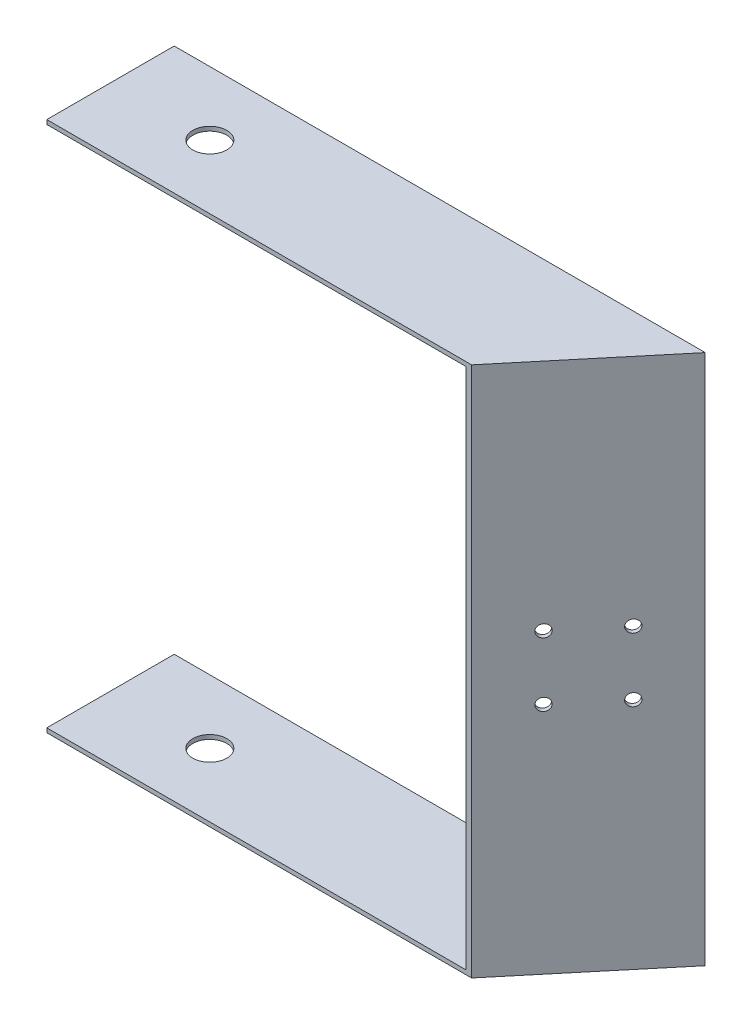
ISO-10303-21;
HEADER;
FILE_DESCRIPTION(('STEP AP214'),'2;1');
FILE_NAME('part.step','',(''),(''),'','','');
FILE_SCHEMA(('AUTOMOTIVE_DESIGN { 1 0 10303 214 1 1 1 1 }'));
ENDSEC;
DATA;
#1=APPLICATION_CONTEXT('core data for automotive mechanical design processes');
#2=APPLICATION_PROTOCOL_DEFINITION('international standard','automotive_design',2000,#1);
#3=PRODUCT_CONTEXT('',#1,'mechanical');
#4=PRODUCT('Part','Part','',(#3));
#5=PRODUCT_RELATED_PRODUCT_CATEGORY('part','',(#4));
#6=PRODUCT_DEFINITION_FORMATION('','',#4);
#7=PRODUCT_DEFINITION_CONTEXT('part definition',#1,'design');
#8=PRODUCT_DEFINITION('design','',#6,#7);
#9=PRODUCT_DEFINITION_SHAPE('','',#8);
#10=(LENGTH_UNIT() NAMED_UNIT(*) SI_UNIT(.MILLI.,.METRE.));
#11=(NAMED_UNIT(*) PLANE_ANGLE_UNIT() SI_UNIT($,.RADIAN.));
#12=(NAMED_UNIT(*) SI_UNIT($,.STERADIAN.) SOLID_ANGLE_UNIT());
#13=UNCERTAINTY_MEASURE_WITH_UNIT(LENGTH_MEASURE(1.E-05),#10,'distance_accuracy_value','');
#14=(GEOMETRIC_REPRESENTATION_CONTEXT(3) GLOBAL_UNCERTAINTY_ASSIGNED_CONTEXT((#13)) GLOBAL_UNIT_ASSIGNED_CONTEXT((#10,
#11,#12)) REPRESENTATION_CONTEXT('',''));
#15=CARTESIAN_POINT('',(0.,0.,0.));
#16=DIRECTION('',(0.,0.,1.));
#17=DIRECTION('',(1.,0.,0.));
#18=AXIS2_PLACEMENT_3D('',#15,#16,#17);
#19=CARTESIAN_POINT('',(0.,0.,30.));
#20=DIRECTION('',(1.,0.,0.));
#21=DIRECTION('',(0.,0.,-1.));
#22=AXIS2_PLACEMENT_3D('',#19,#20,#21);
#23=PLANE('',#22);
#24=DIRECTION('',(0.,0.,-1.));
#25=VECTOR('',#24,1.);
#26=CARTESIAN_POINT('',(0.,124.,30.));
#27=LINE('',#26,#25);
#28=CARTESIAN_POINT('',(0.,124.,30.));
#29=VERTEX_POINT('',#28);
#30=CARTESIAN_POINT('',(0.,124.,0.));
#31=VERTEX_POINT('',#30);
#32=EDGE_CURVE('E156',#29,#31,#27,.T.);
#33=ORIENTED_EDGE('',*,*,#32,.F.);
#34=DIRECTION('',(0.,-1.,0.));
#35=VECTOR('',#34,1.);
#36=CARTESIAN_POINT('',(0.,0.,30.));
#37=LINE('',#36,#35);
#38=CARTESIAN_POINT('',(0.,125.,30.));
#39=VERTEX_POINT('',#38);
#40=EDGE_CURVE('E98',#39,#29,#37,.T.);
#41=ORIENTED_EDGE('',*,*,#40,.F.);
#42=DIRECTION('',(0.,0.,-1.));
#43=VECTOR('',#42,1.);
#44=CARTESIAN_POINT('',(0.,125.,30.));
#45=LINE('',#44,#43);
#46=CARTESIAN_POINT('',(0.,125.,0.));
#47=VERTEX_POINT('',#46);
#48=EDGE_CURVE('E46',#39,#47,#45,.T.);
#49=ORIENTED_EDGE('',*,*,#48,.T.);
#50=DIRECTION('',(0.,-1.,0.));
#51=VECTOR('',#50,1.);
#52=CARTESIAN_POINT('',(0.,0.,0.));
#53=LINE('',#52,#51);
#54=EDGE_CURVE('E97',#47,#31,#53,.T.);
#55=ORIENTED_EDGE('',*,*,#54,.T.);
#56=EDGE_LOOP('',(#33,#41,#49,#55));
#57=FACE_BOUND('',#56,.T.);
#58=ADVANCED_FACE('F37',(#57),#23,.F.);
#59=CARTESIAN_POINT('',(0.,0.,30.));
#60=DIRECTION('',(0.,0.,-1.));
#61=DIRECTION('',(-1.,0.,0.));
#62=AXIS2_PLACEMENT_3D('',#59,#60,#61);
#63=PLANE('',#62);
#64=DIRECTION('',(1.,0.,0.));
#65=VECTOR('',#64,1.);
#66=CARTESIAN_POINT('',(0.,1.,30.));
#67=LINE('',#66,#65);
#68=CARTESIAN_POINT('',(0.,1.,30.));
#69=VERTEX_POINT('',#68);
#70=CARTESIAN_POINT('',(98.6982917206822,1.,30.));
#71=VERTEX_POINT('',#70);
#72=EDGE_CURVE('E157',#69,#71,#67,.T.);
#73=ORIENTED_EDGE('',*,*,#72,.F.);
#74=CARTESIAN_POINT('',(0.,0.,30.));
#75=VERTEX_POINT('',#74);
#76=EDGE_CURVE('E90',#69,#75,#37,.T.);
#77=ORIENTED_EDGE('',*,*,#76,.T.);
#78=DIRECTION('',(1.,0.,0.));
#79=VECTOR('',#78,1.);
#80=CARTESIAN_POINT('',(0.,0.,30.));
#81=LINE('',#80,#79);
#82=CARTESIAN_POINT('',(100.,0.,30.));
#83=VERTEX_POINT('',#82);
#84=EDGE_CURVE('E174',#75,#83,#81,.T.);
#85=ORIENTED_EDGE('',*,*,#84,.T.);
#86=DIRECTION('',(0.,1.,0.));
#87=VECTOR('',#86,1.);
#88=CARTESIAN_POINT('',(100.,0.,30.));
#89=LINE('',#88,#87);
#90=CARTESIAN_POINT('',(100.,125.,30.));
#91=VERTEX_POINT('',#90);
#92=EDGE_CURVE('E109',#83,#91,#89,.T.);
#93=ORIENTED_EDGE('',*,*,#92,.T.);
#94=DIRECTION('',(-1.,0.,0.));
#95=VECTOR('',#94,1.);
#96=CARTESIAN_POINT('',(0.,125.,30.));
#97=LINE('',#96,#95);
#98=EDGE_CURVE('E63',#91,#39,#97,.T.);
#99=ORIENTED_EDGE('',*,*,#98,.T.);
#100=ORIENTED_EDGE('',*,*,#40,.T.);
#101=DIRECTION('',(-1.,0.,0.));
#102=VECTOR('',#101,1.);
#103=CARTESIAN_POINT('',(0.,124.,30.));
#104=LINE('',#103,#102);
#105=CARTESIAN_POINT('',(98.6982917206822,124.,30.));
#106=VERTEX_POINT('',#105);
#107=EDGE_CURVE('E160',#106,#29,#104,.T.);
#108=ORIENTED_EDGE('',*,*,#107,.F.);
#109=DIRECTION('',(0.,1.,0.));
#110=VECTOR('',#109,1.);
#111=CARTESIAN_POINT('',(98.6982917206822,0.,30.));
#112=LINE('',#111,#110);
#113=EDGE_CURVE('E147',#71,#106,#112,.T.);
#114=ORIENTED_EDGE('',*,*,#113,.F.);
#115=EDGE_LOOP('',(#73,#77,#85,#93,#99,#100,#108,#114));
#116=FACE_BOUND('',#115,.T.);
#117=ADVANCED_FACE('F178',(#116),#63,.F.);
#118=CARTESIAN_POINT('',(0.,0.,0.));
#119=DIRECTION('',(0.,0.,-1.));
#120=DIRECTION('',(-1.,0.,0.));
#121=AXIS2_PLACEMENT_3D('',#118,#119,#120);
#122=PLANE('',#121);
#123=DIRECTION('',(0.,1.,0.));
#124=VECTOR('',#123,1.);
#125=CARTESIAN_POINT('',(123.698291720682,0.,0.));
#126=LINE('',#125,#124);
#127=CARTESIAN_POINT('',(123.698291720682,1.,0.));
#128=VERTEX_POINT('',#127);
#129=CARTESIAN_POINT('',(123.698291720682,124.,0.));
#130=VERTEX_POINT('',#129);
#131=EDGE_CURVE('E54',#128,#130,#126,.T.);
#132=ORIENTED_EDGE('',*,*,#131,.T.);
#133=DIRECTION('',(-1.,0.,0.));
#134=VECTOR('',#133,1.);
#135=CARTESIAN_POINT('',(0.,124.,0.));
#136=LINE('',#135,#134);
#137=EDGE_CURVE('E103',#130,#31,#136,.T.);
#138=ORIENTED_EDGE('',*,*,#137,.T.);
#139=ORIENTED_EDGE('',*,*,#54,.F.);
#140=DIRECTION('',(-1.,0.,0.));
#141=VECTOR('',#140,1.);
#142=CARTESIAN_POINT('',(0.,125.,0.));
#143=LINE('',#142,#141);
#144=CARTESIAN_POINT('',(125.,125.,0.));
#145=VERTEX_POINT('',#144);
#146=EDGE_CURVE('E80',#145,#47,#143,.T.);
#147=ORIENTED_EDGE('',*,*,#146,.F.);
#148=DIRECTION('',(0.,1.,0.));
#149=VECTOR('',#148,1.);
#150=CARTESIAN_POINT('',(125.,0.,0.));
#151=LINE('',#150,#149);
#152=CARTESIAN_POINT('',(125.,0.,0.));
#153=VERTEX_POINT('',#152);
#154=EDGE_CURVE('E91',#153,#145,#151,.T.);
#155=ORIENTED_EDGE('',*,*,#154,.F.);
#156=DIRECTION('',(1.,0.,0.));
#157=VECTOR('',#156,1.);
#158=CARTESIAN_POINT('',(0.,0.,0.));
#159=LINE('',#158,#157);
#160=CARTESIAN_POINT('',(0.,0.,0.));
#161=VERTEX_POINT('',#160);
#162=EDGE_CURVE('E104',#161,#153,#159,.T.);
#163=ORIENTED_EDGE('',*,*,#162,.F.);
#164=CARTESIAN_POINT('',(0.,1.,0.));
#165=VERTEX_POINT('',#164);
#166=EDGE_CURVE('E105',#165,#161,#53,.T.);
#167=ORIENTED_EDGE('',*,*,#166,.F.);
#168=DIRECTION('',(1.,0.,0.));
#169=VECTOR('',#168,1.);
#170=CARTESIAN_POINT('',(0.,1.,0.));
#171=LINE('',#170,#169);
#172=EDGE_CURVE('E150',#165,#128,#171,.T.);
#173=ORIENTED_EDGE('',*,*,#172,.T.);
#174=EDGE_LOOP('',(#132,#138,#139,#147,#155,#163,#167,#173));
#175=FACE_BOUND('',#174,.T.);
#176=ADVANCED_FACE('F101',(#175),#122,.T.);
#177=ORIENTED_EDGE('',*,*,#76,.F.);
#178=DIRECTION('',(0.,0.,-1.));
#179=VECTOR('',#178,1.);
#180=CARTESIAN_POINT('',(0.,1.,30.));
#181=LINE('',#180,#179);
#182=EDGE_CURVE('E153',#69,#165,#181,.T.);
#183=ORIENTED_EDGE('',*,*,#182,.T.);
#184=ORIENTED_EDGE('',*,*,#166,.T.);
#185=DIRECTION('',(0.,0.,-1.));
#186=VECTOR('',#185,1.);
#187=CARTESIAN_POINT('',(0.,0.,30.));
#188=LINE('',#187,#186);
#189=EDGE_CURVE('E11',#75,#161,#188,.T.);
#190=ORIENTED_EDGE('',*,*,#189,.F.);
#191=EDGE_LOOP('',(#177,#183,#184,#190));
#192=FACE_BOUND('',#191,.T.);
#193=ADVANCED_FACE('F39',(#192),#23,.F.);
#194=CARTESIAN_POINT('',(0.,0.,30.));
#195=DIRECTION('',(0.,1.,0.));
#196=DIRECTION('',(0.,0.,1.));
#197=AXIS2_PLACEMENT_3D('',#194,#195,#196);
#198=PLANE('',#197);
#199=CARTESIAN_POINT('',(23.3801743676135,0.,15.));
#200=DIRECTION('',(0.,-1.,0.));
#201=DIRECTION('',(0.,0.,-1.));
#202=AXIS2_PLACEMENT_3D('',#199,#200,#201);
#203=CIRCLE('',#202,4.);
#204=CARTESIAN_POINT('',(23.3801743676135,0.,11.));
#205=VERTEX_POINT('',#204);
#206=EDGE_CURVE('E131',#205,#205,#203,.T.);
#207=ORIENTED_EDGE('',*,*,#206,.F.);
#208=EDGE_LOOP('',(#207));
#209=FACE_BOUND('',#208,.T.);
#210=ORIENTED_EDGE('',*,*,#162,.T.);
#211=DIRECTION('',(-0.64018439966448,0.,0.768221279597376));
#212=VECTOR('',#211,1.);
#213=CARTESIAN_POINT('',(125.,0.,0.));
#214=LINE('',#213,#212);
#215=EDGE_CURVE('E169',#153,#83,#214,.T.);
#216=ORIENTED_EDGE('',*,*,#215,.T.);
#217=ORIENTED_EDGE('',*,*,#84,.F.);
#218=ORIENTED_EDGE('',*,*,#189,.T.);
#219=EDGE_LOOP('',(#210,#216,#217,#218));
#220=FACE_BOUND('',#219,.T.);
#221=ADVANCED_FACE('F185',(#209,#220),#198,.F.);
#222=CARTESIAN_POINT('',(0.,125.,30.));
#223=DIRECTION('',(0.,-1.,0.));
#224=DIRECTION('',(0.,0.,-1.));
#225=AXIS2_PLACEMENT_3D('',#222,#223,#224);
#226=PLANE('',#225);
#227=CARTESIAN_POINT('',(23.3801743676135,125.,15.));
#228=DIRECTION('',(0.,-1.,0.));
#229=DIRECTION('',(0.,0.,-1.));
#230=AXIS2_PLACEMENT_3D('',#227,#228,#229);
#231=CIRCLE('',#230,4.);
#232=CARTESIAN_POINT('',(23.3801743676135,125.,11.));
#233=VERTEX_POINT('',#232);
#234=EDGE_CURVE('E119',#233,#233,#231,.T.);
#235=ORIENTED_EDGE('',*,*,#234,.T.);
#236=EDGE_LOOP('',(#235));
#237=FACE_BOUND('',#236,.T.);
#238=ORIENTED_EDGE('',*,*,#98,.F.);
#239=DIRECTION('',(-0.64018439966448,0.,0.768221279597376));
#240=VECTOR('',#239,1.);
#241=CARTESIAN_POINT('',(125.,125.,0.));
#242=LINE('',#241,#240);
#243=EDGE_CURVE('E86',#145,#91,#242,.T.);
#244=ORIENTED_EDGE('',*,*,#243,.F.);
#245=ORIENTED_EDGE('',*,*,#146,.T.);
#246=ORIENTED_EDGE('',*,*,#48,.F.);
#247=EDGE_LOOP('',(#238,#244,#245,#246));
#248=FACE_BOUND('',#247,.T.);
#249=ADVANCED_FACE('F82',(#237,#248),#226,.F.);
#250=CARTESIAN_POINT('',(125.,0.,0.));
#251=DIRECTION('',(-0.768221279597376,0.,-0.64018439966448));
#252=DIRECTION('',(-0.64018439966448,0.,0.768221279597376));
#253=AXIS2_PLACEMENT_3D('',#250,#251,#252);
#254=PLANE('',#253);
#255=CARTESIAN_POINT('',(117.301382997484,70.,9.23834040301972));
#256=DIRECTION('',(0.768221279597376,0.,0.64018439966448));
#257=DIRECTION('',(0.64018439966448,0.,-0.768221279597376));
#258=AXIS2_PLACEMENT_3D('',#255,#256,#257);
#259=CIRCLE('',#258,1.45);
#260=CARTESIAN_POINT('',(118.229650376997,70.,8.12441954760353));
#261=VERTEX_POINT('',#260);
#262=EDGE_CURVE('E284',#261,#261,#259,.T.);
#263=ORIENTED_EDGE('',*,*,#262,.F.);
#264=EDGE_LOOP('',(#263));
#265=FACE_BOUND('',#264,.T.);
#266=CARTESIAN_POINT('',(107.698617002516,55.,20.7616595969804));
#267=DIRECTION('',(0.768221279597376,0.,0.64018439966448));
#268=DIRECTION('',(0.64018439966448,0.,-0.768221279597376));
#269=AXIS2_PLACEMENT_3D('',#266,#267,#268);
#270=CIRCLE('',#269,1.44999999999999);
#271=CARTESIAN_POINT('',(108.62688438203,55.,19.6477387415642));
#272=VERTEX_POINT('',#271);
#273=EDGE_CURVE('E281',#272,#272,#270,.T.);
#274=ORIENTED_EDGE('',*,*,#273,.F.);
#275=EDGE_LOOP('',(#274));
#276=FACE_BOUND('',#275,.T.);
#277=CARTESIAN_POINT('',(117.301382997484,55.,9.23834040301972));
#278=DIRECTION('',(0.768221279597376,0.,0.64018439966448));
#279=DIRECTION('',(0.64018439966448,0.,-0.768221279597376));
#280=AXIS2_PLACEMENT_3D('',#277,#278,#279);
#281=CIRCLE('',#280,1.44999999999999);
#282=CARTESIAN_POINT('',(118.229650376997,55.,8.12441954760353));
#283=VERTEX_POINT('',#282);
#284=EDGE_CURVE('E279',#283,#283,#281,.T.);
#285=ORIENTED_EDGE('',*,*,#284,.F.);
#286=EDGE_LOOP('',(#285));
#287=FACE_BOUND('',#286,.T.);
#288=CARTESIAN_POINT('',(107.698617002516,70.,20.7616595969804));
#289=DIRECTION('',(0.768221279597376,0.,0.64018439966448));
#290=DIRECTION('',(0.64018439966448,0.,-0.768221279597376));
#291=AXIS2_PLACEMENT_3D('',#288,#289,#290);
#292=CIRCLE('',#291,1.45);
#293=CARTESIAN_POINT('',(108.62688438203,70.,19.6477387415642));
#294=VERTEX_POINT('',#293);
#295=EDGE_CURVE('E124',#294,#294,#292,.T.);
#296=ORIENTED_EDGE('',*,*,#295,.F.);
#297=EDGE_LOOP('',(#296));
#298=FACE_BOUND('',#297,.T.);
#299=ORIENTED_EDGE('',*,*,#243,.T.);
#300=ORIENTED_EDGE('',*,*,#92,.F.);
#301=ORIENTED_EDGE('',*,*,#215,.F.);
#302=ORIENTED_EDGE('',*,*,#154,.T.);
#303=EDGE_LOOP('',(#299,#300,#301,#302));
#304=FACE_BOUND('',#303,.T.);
#305=ADVANCED_FACE('F193',(#265,#276,#287,#298,#304),#254,.F.);
#306=CARTESIAN_POINT('',(0.,1.,30.));
#307=DIRECTION('',(0.,1.,0.));
#308=DIRECTION('',(0.,0.,1.));
#309=AXIS2_PLACEMENT_3D('',#306,#307,#308);
#310=PLANE('',#309);
#311=CARTESIAN_POINT('',(23.3801743676135,1.,15.));
#312=DIRECTION('',(0.,1.,0.));
#313=DIRECTION('',(0.,0.,1.));
#314=AXIS2_PLACEMENT_3D('',#311,#312,#313);
#315=CIRCLE('',#314,4.);
#316=CARTESIAN_POINT('',(23.3801743676135,1.,19.));
#317=VERTEX_POINT('',#316);
#318=EDGE_CURVE('E118',#317,#317,#315,.T.);
#319=ORIENTED_EDGE('',*,*,#318,.F.);
#320=EDGE_LOOP('',(#319));
#321=FACE_BOUND('',#320,.T.);
#322=ORIENTED_EDGE('',*,*,#172,.F.);
#323=ORIENTED_EDGE('',*,*,#182,.F.);
#324=ORIENTED_EDGE('',*,*,#72,.T.);
#325=DIRECTION('',(-0.64018439966448,0.,0.768221279597376));
#326=VECTOR('',#325,1.);
#327=CARTESIAN_POINT('',(58.2481721630256,1.,78.540143469188));
#328=LINE('',#327,#326);
#329=EDGE_CURVE('E145',#128,#71,#328,.T.);
#330=ORIENTED_EDGE('',*,*,#329,.F.);
#331=EDGE_LOOP('',(#322,#323,#324,#330));
#332=FACE_BOUND('',#331,.T.);
#333=ADVANCED_FACE('F208',(#321,#332),#310,.T.);
#334=CARTESIAN_POINT('',(0.,124.,30.));
#335=DIRECTION('',(0.,-1.,0.));
#336=DIRECTION('',(0.,0.,-1.));
#337=AXIS2_PLACEMENT_3D('',#334,#335,#336);
#338=PLANE('',#337);
#339=CARTESIAN_POINT('',(23.3801743676135,124.,15.));
#340=DIRECTION('',(0.,-1.,0.));
#341=DIRECTION('',(0.,0.,-1.));
#342=AXIS2_PLACEMENT_3D('',#339,#340,#341);
#343=CIRCLE('',#342,4.);
#344=CARTESIAN_POINT('',(23.3801743676135,124.,11.));
#345=VERTEX_POINT('',#344);
#346=EDGE_CURVE('E115',#345,#345,#343,.T.);
#347=ORIENTED_EDGE('',*,*,#346,.F.);
#348=EDGE_LOOP('',(#347));
#349=FACE_BOUND('',#348,.T.);
#350=ORIENTED_EDGE('',*,*,#107,.T.);
#351=ORIENTED_EDGE('',*,*,#32,.T.);
#352=ORIENTED_EDGE('',*,*,#137,.F.);
#353=DIRECTION('',(-0.64018439966448,0.,0.768221279597376));
#354=VECTOR('',#353,1.);
#355=CARTESIAN_POINT('',(124.231778720403,124.,-0.64018439966448));
#356=LINE('',#355,#354);
#357=EDGE_CURVE('E144',#130,#106,#356,.T.);
#358=ORIENTED_EDGE('',*,*,#357,.T.);
#359=EDGE_LOOP('',(#350,#351,#352,#358));
#360=FACE_BOUND('',#359,.T.);
#361=ADVANCED_FACE('F213',(#349,#360),#338,.T.);
#362=CARTESIAN_POINT('',(124.231778720403,0.,-0.64018439966448));
#363=DIRECTION('',(-0.768221279597376,0.,-0.64018439966448));
#364=DIRECTION('',(-0.64018439966448,0.,0.768221279597376));
#365=AXIS2_PLACEMENT_3D('',#362,#363,#364);
#366=PLANE('',#365);
#367=CARTESIAN_POINT('',(116.533161717886,70.,8.5981560033552));
#368=DIRECTION('',(-0.768221279597376,0.,-0.64018439966448));
#369=DIRECTION('',(-0.64018439966448,0.,0.768221279597376));
#370=AXIS2_PLACEMENT_3D('',#367,#368,#369);
#371=CIRCLE('',#370,1.45);
#372=CARTESIAN_POINT('',(115.604894338373,70.,9.71207685877139));
#373=VERTEX_POINT('',#372);
#374=EDGE_CURVE('E41',#373,#373,#371,.T.);
#375=ORIENTED_EDGE('',*,*,#374,.F.);
#376=EDGE_LOOP('',(#375));
#377=FACE_BOUND('',#376,.T.);
#378=CARTESIAN_POINT('',(106.930395722919,55.,20.1214751973158));
#379=DIRECTION('',(-0.768221279597376,0.,-0.64018439966448));
#380=DIRECTION('',(-0.64018439966448,0.,0.768221279597376));
#381=AXIS2_PLACEMENT_3D('',#378,#379,#380);
#382=CIRCLE('',#381,1.44999999999999);
#383=CARTESIAN_POINT('',(106.002128343406,55.,21.235396052732));
#384=VERTEX_POINT('',#383);
#385=EDGE_CURVE('E126',#384,#384,#382,.T.);
#386=ORIENTED_EDGE('',*,*,#385,.F.);
#387=EDGE_LOOP('',(#386));
#388=FACE_BOUND('',#387,.T.);
#389=CARTESIAN_POINT('',(116.533161717886,55.,8.5981560033552));
#390=DIRECTION('',(-0.768221279597376,0.,-0.64018439966448));
#391=DIRECTION('',(-0.64018439966448,0.,0.768221279597376));
#392=AXIS2_PLACEMENT_3D('',#389,#390,#391);
#393=CIRCLE('',#392,1.44999999999999);
#394=CARTESIAN_POINT('',(115.604894338373,55.,9.71207685877139));
#395=VERTEX_POINT('',#394);
#396=EDGE_CURVE('E123',#395,#395,#393,.T.);
#397=ORIENTED_EDGE('',*,*,#396,.F.);
#398=EDGE_LOOP('',(#397));
#399=FACE_BOUND('',#398,.T.);
#400=CARTESIAN_POINT('',(106.930395722919,70.,20.1214751973158));
#401=DIRECTION('',(-0.768221279597376,0.,-0.64018439966448));
#402=DIRECTION('',(-0.64018439966448,0.,0.768221279597376));
#403=AXIS2_PLACEMENT_3D('',#400,#401,#402);
#404=CIRCLE('',#403,1.45);
#405=CARTESIAN_POINT('',(106.002128343406,70.,21.235396052732));
#406=VERTEX_POINT('',#405);
#407=EDGE_CURVE('E120',#406,#406,#404,.T.);
#408=ORIENTED_EDGE('',*,*,#407,.F.);
#409=EDGE_LOOP('',(#408));
#410=FACE_BOUND('',#409,.T.);
#411=ORIENTED_EDGE('',*,*,#357,.F.);
#412=ORIENTED_EDGE('',*,*,#131,.F.);
#413=ORIENTED_EDGE('',*,*,#329,.T.);
#414=ORIENTED_EDGE('',*,*,#113,.T.);
#415=EDGE_LOOP('',(#411,#412,#413,#414));
#416=FACE_BOUND('',#415,.T.);
#417=ADVANCED_FACE('F210',(#377,#388,#399,#410,#416),#366,.T.);
#418=CARTESIAN_POINT('',(23.3801743676135,125.,15.));
#419=DIRECTION('',(0.,-1.,0.));
#420=DIRECTION('',(0.,0.,-1.));
#421=AXIS2_PLACEMENT_3D('',#418,#419,#420);
#422=CYLINDRICAL_SURFACE('',#421,4.);
#423=ORIENTED_EDGE('',*,*,#346,.T.);
#424=EDGE_LOOP('',(#423));
#425=FACE_BOUND('',#424,.T.);
#426=ORIENTED_EDGE('',*,*,#234,.F.);
#427=EDGE_LOOP('',(#426));
#428=FACE_BOUND('',#427,.T.);
#429=ADVANCED_FACE('F221',(#425,#428),#422,.F.);
#430=ORIENTED_EDGE('',*,*,#318,.T.);
#431=EDGE_LOOP('',(#430));
#432=FACE_BOUND('',#431,.T.);
#433=ORIENTED_EDGE('',*,*,#206,.T.);
#434=EDGE_LOOP('',(#433));
#435=FACE_BOUND('',#434,.T.);
#436=ADVANCED_FACE('F252',(#432,#435),#422,.F.);
#437=CARTESIAN_POINT('',(11.6709570528445,70.,-59.2613903610796));
#438=DIRECTION('',(0.768221279597376,0.,0.64018439966448));
#439=DIRECTION('',(0.64018439966448,0.,-0.768221279597376));
#440=AXIS2_PLACEMENT_3D('',#437,#438,#439);
#441=CYLINDRICAL_SURFACE('',#440,1.45);
#442=ORIENTED_EDGE('',*,*,#407,.T.);
#443=EDGE_LOOP('',(#442));
#444=FACE_BOUND('',#443,.T.);
#445=ORIENTED_EDGE('',*,*,#295,.T.);
#446=EDGE_LOOP('',(#445));
#447=FACE_BOUND('',#446,.T.);
#448=ADVANCED_FACE('F258',(#444,#447),#441,.F.);
#449=CARTESIAN_POINT('',(21.2737230478117,55.,-70.7847095550403));
#450=DIRECTION('',(0.768221279597376,0.,0.64018439966448));
#451=DIRECTION('',(0.64018439966448,0.,-0.768221279597376));
#452=AXIS2_PLACEMENT_3D('',#449,#450,#451);
#453=CYLINDRICAL_SURFACE('',#452,1.44999999999999);
#454=ORIENTED_EDGE('',*,*,#396,.T.);
#455=EDGE_LOOP('',(#454));
#456=FACE_BOUND('',#455,.T.);
#457=ORIENTED_EDGE('',*,*,#284,.T.);
#458=EDGE_LOOP('',(#457));
#459=FACE_BOUND('',#458,.T.);
#460=ADVANCED_FACE('F263',(#456,#459),#453,.F.);
#461=CARTESIAN_POINT('',(11.6709570528445,55.,-59.2613903610796));
#462=DIRECTION('',(0.768221279597376,0.,0.64018439966448));
#463=DIRECTION('',(0.64018439966448,0.,-0.768221279597376));
#464=AXIS2_PLACEMENT_3D('',#461,#462,#463);
#465=CYLINDRICAL_SURFACE('',#464,1.44999999999999);
#466=ORIENTED_EDGE('',*,*,#385,.T.);
#467=EDGE_LOOP('',(#466));
#468=FACE_BOUND('',#467,.T.);
#469=ORIENTED_EDGE('',*,*,#273,.T.);
#470=EDGE_LOOP('',(#469));
#471=FACE_BOUND('',#470,.T.);
#472=ADVANCED_FACE('F265',(#468,#471),#465,.F.);
#473=CARTESIAN_POINT('',(21.2737230478117,70.,-70.7847095550403));
#474=DIRECTION('',(0.768221279597376,0.,0.64018439966448));
#475=DIRECTION('',(0.64018439966448,0.,-0.768221279597376));
#476=AXIS2_PLACEMENT_3D('',#473,#474,#475);
#477=CYLINDRICAL_SURFACE('',#476,1.45);
#478=ORIENTED_EDGE('',*,*,#374,.T.);
#479=EDGE_LOOP('',(#478));
#480=FACE_BOUND('',#479,.T.);
#481=ORIENTED_EDGE('',*,*,#262,.T.);
#482=EDGE_LOOP('',(#481));
#483=FACE_BOUND('',#482,.T.);
#484=ADVANCED_FACE('F268',(#480,#483),#477,.F.);
#485=CLOSED_SHELL('',(#58,#117,#176,#193,#221,#249,#305,#333,#361,#417,#429,#436,#448,#460,#472,#484));
#486=MANIFOLD_SOLID_BREP('B2',#485);
#487=ADVANCED_BREP_SHAPE_REPRESENTATION('',(#18,#486),#14);
#488=SHAPE_DEFINITION_REPRESENTATION(#9,#487);
ENDSEC;
END-ISO-10303-21;
